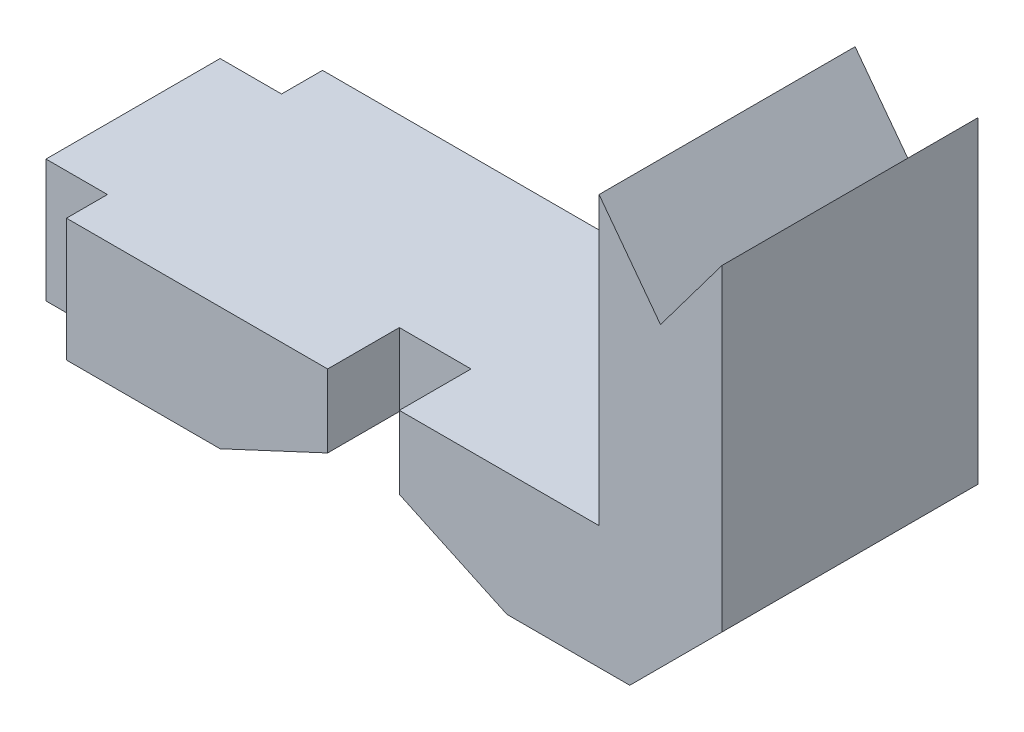
ISO-10303-21;
HEADER;
FILE_DESCRIPTION(('STEP AP214'),'2;1');
FILE_NAME('part.step','',(''),(''),'','','');
FILE_SCHEMA(('AUTOMOTIVE_DESIGN { 1 0 10303 214 1 1 1 1 }'));
ENDSEC;
DATA;
#1=APPLICATION_CONTEXT('core data for automotive mechanical design processes');
#2=APPLICATION_PROTOCOL_DEFINITION('international standard','automotive_design',2000,#1);
#3=PRODUCT_CONTEXT('',#1,'mechanical');
#4=PRODUCT('Part','Part','',(#3));
#5=PRODUCT_RELATED_PRODUCT_CATEGORY('part','',(#4));
#6=PRODUCT_DEFINITION_FORMATION('','',#4);
#7=PRODUCT_DEFINITION_CONTEXT('part definition',#1,'design');
#8=PRODUCT_DEFINITION('design','',#6,#7);
#9=PRODUCT_DEFINITION_SHAPE('','',#8);
#10=(LENGTH_UNIT() NAMED_UNIT(*) SI_UNIT(.MILLI.,.METRE.));
#11=(NAMED_UNIT(*) PLANE_ANGLE_UNIT() SI_UNIT($,.RADIAN.));
#12=(NAMED_UNIT(*) SI_UNIT($,.STERADIAN.) SOLID_ANGLE_UNIT());
#13=UNCERTAINTY_MEASURE_WITH_UNIT(LENGTH_MEASURE(1.E-05),#10,'distance_accuracy_value','');
#14=(GEOMETRIC_REPRESENTATION_CONTEXT(3) GLOBAL_UNCERTAINTY_ASSIGNED_CONTEXT((#13)) GLOBAL_UNIT_ASSIGNED_CONTEXT((#10,
#11,#12)) REPRESENTATION_CONTEXT('',''));
#15=CARTESIAN_POINT('',(0.,0.,0.));
#16=DIRECTION('',(0.,0.,1.));
#17=DIRECTION('',(1.,0.,0.));
#18=AXIS2_PLACEMENT_3D('',#15,#16,#17);
#19=CARTESIAN_POINT('',(0.,0.,25.));
#20=DIRECTION('',(0.,0.,1.));
#21=DIRECTION('',(1.,0.,0.));
#22=AXIS2_PLACEMENT_3D('',#19,#20,#21);
#23=PLANE('',#22);
#24=DIRECTION('',(0.,1.,0.));
#25=VECTOR('',#24,1.);
#26=CARTESIAN_POINT('',(3.5,-20.,25.));
#27=LINE('',#26,#25);
#28=CARTESIAN_POINT('',(3.5,-15.1037695893726,25.));
#29=VERTEX_POINT('',#28);
#30=CARTESIAN_POINT('',(3.5,-8.,25.));
#31=VERTEX_POINT('',#30);
#32=EDGE_CURVE('E180',#29,#31,#27,.T.);
#33=ORIENTED_EDGE('',*,*,#32,.F.);
#34=DIRECTION('',(0.906307787036653,-0.422618261740694,0.));
#35=VECTOR('',#34,1.);
#36=CARTESIAN_POINT('',(-5.15995769899554,-11.0655649950327,25.));
#37=LINE('',#36,#35);
#38=CARTESIAN_POINT('',(14.,-20.,25.));
#39=VERTEX_POINT('',#38);
#40=EDGE_CURVE('E242',#29,#39,#37,.T.);
#41=ORIENTED_EDGE('',*,*,#40,.T.);
#42=DIRECTION('',(1.,0.,0.));
#43=VECTOR('',#42,1.);
#44=CARTESIAN_POINT('',(0.,-20.,25.));
#45=LINE('',#44,#43);
#46=CARTESIAN_POINT('',(26.,-20.,25.));
#47=VERTEX_POINT('',#46);
#48=EDGE_CURVE('E278',#39,#47,#45,.T.);
#49=ORIENTED_EDGE('',*,*,#48,.T.);
#50=DIRECTION('',(0.707106781186551,0.707106781186544,0.));
#51=VECTOR('',#50,1.);
#52=CARTESIAN_POINT('',(22.9999999999999,-23.0000000000001,25.));
#53=LINE('',#52,#51);
#54=CARTESIAN_POINT('',(35.,-11.0000000000001,25.));
#55=VERTEX_POINT('',#54);
#56=EDGE_CURVE('E255',#47,#55,#53,.T.);
#57=ORIENTED_EDGE('',*,*,#56,.T.);
#58=DIRECTION('',(0.,1.,0.));
#59=VECTOR('',#58,1.);
#60=CARTESIAN_POINT('',(35.,0.,25.));
#61=LINE('',#60,#59);
#62=CARTESIAN_POINT('',(35.,20.,25.));
#63=VERTEX_POINT('',#62);
#64=EDGE_CURVE('E282',#55,#63,#61,.T.);
#65=ORIENTED_EDGE('',*,*,#64,.T.);
#66=DIRECTION('',(0.6,0.8,0.));
#67=VECTOR('',#66,1.);
#68=CARTESIAN_POINT('',(12.8,-9.6,25.));
#69=LINE('',#68,#67);
#70=CARTESIAN_POINT('',(29.,12.,25.));
#71=VERTEX_POINT('',#70);
#72=EDGE_CURVE('E234',#71,#63,#69,.T.);
#73=ORIENTED_EDGE('',*,*,#72,.F.);
#74=DIRECTION('',(0.6,-0.8,0.));
#75=VECTOR('',#74,1.);
#76=CARTESIAN_POINT('',(24.32,18.24,25.));
#77=LINE('',#76,#75);
#78=CARTESIAN_POINT('',(23.,20.,25.));
#79=VERTEX_POINT('',#78);
#80=EDGE_CURVE('E226',#79,#71,#77,.T.);
#81=ORIENTED_EDGE('',*,*,#80,.F.);
#82=DIRECTION('',(0.,1.,0.));
#83=VECTOR('',#82,1.);
#84=CARTESIAN_POINT('',(23.,0.,25.));
#85=LINE('',#84,#83);
#86=CARTESIAN_POINT('',(23.,-8.,25.));
#87=VERTEX_POINT('',#86);
#88=EDGE_CURVE('E271',#87,#79,#85,.T.);
#89=ORIENTED_EDGE('',*,*,#88,.F.);
#90=DIRECTION('',(1.,0.,0.));
#91=VECTOR('',#90,1.);
#92=CARTESIAN_POINT('',(0.,-8.,25.));
#93=LINE('',#92,#91);
#94=EDGE_CURVE('E274',#31,#87,#93,.T.);
#95=ORIENTED_EDGE('',*,*,#94,.F.);
#96=EDGE_LOOP('',(#33,#41,#49,#57,#65,#73,#81,#89,#95));
#97=FACE_BOUND('',#96,.T.);
#98=ADVANCED_FACE('F36',(#97),#23,.T.);
#99=CARTESIAN_POINT('',(0.,-20.,25.));
#100=DIRECTION('',(0.,1.,0.));
#101=DIRECTION('',(0.,0.,1.));
#102=AXIS2_PLACEMENT_3D('',#99,#100,#101);
#103=PLANE('',#102);
#104=DIRECTION('',(0.,0.,1.));
#105=VECTOR('',#104,1.);
#106=CARTESIAN_POINT('',(14.,-20.,0.));
#107=LINE('',#106,#105);
#108=CARTESIAN_POINT('',(14.,-20.,0.));
#109=VERTEX_POINT('',#108);
#110=EDGE_CURVE('E252',#109,#39,#107,.T.);
#111=ORIENTED_EDGE('',*,*,#110,.F.);
#112=DIRECTION('',(1.,0.,0.));
#113=VECTOR('',#112,1.);
#114=CARTESIAN_POINT('',(0.,-20.,0.));
#115=LINE('',#114,#113);
#116=CARTESIAN_POINT('',(26.,-20.,0.));
#117=VERTEX_POINT('',#116);
#118=EDGE_CURVE('E290',#109,#117,#115,.T.);
#119=ORIENTED_EDGE('',*,*,#118,.T.);
#120=DIRECTION('',(0.,0.,1.));
#121=VECTOR('',#120,1.);
#122=CARTESIAN_POINT('',(26.,-20.,0.));
#123=LINE('',#122,#121);
#124=EDGE_CURVE('E263',#117,#47,#123,.T.);
#125=ORIENTED_EDGE('',*,*,#124,.T.);
#126=ORIENTED_EDGE('',*,*,#48,.F.);
#127=EDGE_LOOP('',(#111,#119,#125,#126));
#128=FACE_BOUND('',#127,.T.);
#129=ADVANCED_FACE('F336',(#128),#103,.F.);
#130=DIRECTION('',(0.,1.,0.));
#131=VECTOR('',#130,1.);
#132=CARTESIAN_POINT('',(-3.5,-20.,25.));
#133=LINE('',#132,#131);
#134=CARTESIAN_POINT('',(-3.5,-15.1037695893726,25.));
#135=VERTEX_POINT('',#134);
#136=CARTESIAN_POINT('',(-3.5,-8.,25.));
#137=VERTEX_POINT('',#136);
#138=EDGE_CURVE('E190',#135,#137,#133,.T.);
#139=ORIENTED_EDGE('',*,*,#138,.T.);
#140=CARTESIAN_POINT('',(-29.,-8.,25.));
#141=VERTEX_POINT('',#140);
#142=EDGE_CURVE('E276',#141,#137,#93,.T.);
#143=ORIENTED_EDGE('',*,*,#142,.F.);
#144=DIRECTION('',(0.,1.,0.));
#145=VECTOR('',#144,1.);
#146=CARTESIAN_POINT('',(-29.,-20.,25.));
#147=LINE('',#146,#145);
#148=CARTESIAN_POINT('',(-29.,-20.,25.));
#149=VERTEX_POINT('',#148);
#150=EDGE_CURVE('E219',#149,#141,#147,.T.);
#151=ORIENTED_EDGE('',*,*,#150,.F.);
#152=CARTESIAN_POINT('',(-14.,-20.,25.));
#153=VERTEX_POINT('',#152);
#154=EDGE_CURVE('E279',#149,#153,#45,.T.);
#155=ORIENTED_EDGE('',*,*,#154,.T.);
#156=DIRECTION('',(-0.906307787036653,-0.422618261740694,0.));
#157=VECTOR('',#156,1.);
#158=CARTESIAN_POINT('',(5.15995769899554,-11.0655649950327,25.));
#159=LINE('',#158,#157);
#160=EDGE_CURVE('E246',#135,#153,#159,.T.);
#161=ORIENTED_EDGE('',*,*,#160,.F.);
#162=EDGE_LOOP('',(#139,#143,#151,#155,#161));
#163=FACE_BOUND('',#162,.T.);
#164=ADVANCED_FACE('F317',(#163),#23,.T.);
#165=CARTESIAN_POINT('',(0.,0.,0.));
#166=DIRECTION('',(0.,0.,1.));
#167=DIRECTION('',(1.,0.,0.));
#168=AXIS2_PLACEMENT_3D('',#165,#166,#167);
#169=PLANE('',#168);
#170=CARTESIAN_POINT('',(-29.,-20.,0.));
#171=VERTEX_POINT('',#170);
#172=CARTESIAN_POINT('',(-14.,-20.,0.));
#173=VERTEX_POINT('',#172);
#174=EDGE_CURVE('E291',#171,#173,#115,.T.);
#175=ORIENTED_EDGE('',*,*,#174,.F.);
#176=DIRECTION('',(0.,1.,0.));
#177=VECTOR('',#176,1.);
#178=CARTESIAN_POINT('',(-29.,-20.,0.));
#179=LINE('',#178,#177);
#180=CARTESIAN_POINT('',(-29.,-8.,0.));
#181=VERTEX_POINT('',#180);
#182=EDGE_CURVE('E205',#171,#181,#179,.T.);
#183=ORIENTED_EDGE('',*,*,#182,.T.);
#184=DIRECTION('',(1.,0.,0.));
#185=VECTOR('',#184,1.);
#186=CARTESIAN_POINT('',(0.,-8.,0.));
#187=LINE('',#186,#185);
#188=CARTESIAN_POINT('',(23.,-8.,0.));
#189=VERTEX_POINT('',#188);
#190=EDGE_CURVE('E288',#181,#189,#187,.T.);
#191=ORIENTED_EDGE('',*,*,#190,.T.);
#192=DIRECTION('',(0.,1.,0.));
#193=VECTOR('',#192,1.);
#194=CARTESIAN_POINT('',(23.,0.,0.));
#195=LINE('',#194,#193);
#196=CARTESIAN_POINT('',(23.,20.,0.));
#197=VERTEX_POINT('',#196);
#198=EDGE_CURVE('E268',#189,#197,#195,.T.);
#199=ORIENTED_EDGE('',*,*,#198,.T.);
#200=DIRECTION('',(0.6,-0.8,0.));
#201=VECTOR('',#200,1.);
#202=CARTESIAN_POINT('',(24.32,18.24,0.));
#203=LINE('',#202,#201);
#204=CARTESIAN_POINT('',(29.,12.,0.));
#205=VERTEX_POINT('',#204);
#206=EDGE_CURVE('E230',#197,#205,#203,.T.);
#207=ORIENTED_EDGE('',*,*,#206,.T.);
#208=DIRECTION('',(0.6,0.8,0.));
#209=VECTOR('',#208,1.);
#210=CARTESIAN_POINT('',(12.8,-9.6,0.));
#211=LINE('',#210,#209);
#212=CARTESIAN_POINT('',(35.,20.,0.));
#213=VERTEX_POINT('',#212);
#214=EDGE_CURVE('E233',#205,#213,#211,.T.);
#215=ORIENTED_EDGE('',*,*,#214,.T.);
#216=DIRECTION('',(0.,1.,0.));
#217=VECTOR('',#216,1.);
#218=CARTESIAN_POINT('',(35.,0.,0.));
#219=LINE('',#218,#217);
#220=CARTESIAN_POINT('',(35.,-11.0000000000001,0.));
#221=VERTEX_POINT('',#220);
#222=EDGE_CURVE('E275',#221,#213,#219,.T.);
#223=ORIENTED_EDGE('',*,*,#222,.F.);
#224=DIRECTION('',(0.707106781186551,0.707106781186544,0.));
#225=VECTOR('',#224,1.);
#226=CARTESIAN_POINT('',(22.9999999999999,-23.0000000000001,0.));
#227=LINE('',#226,#225);
#228=EDGE_CURVE('E261',#117,#221,#227,.T.);
#229=ORIENTED_EDGE('',*,*,#228,.F.);
#230=ORIENTED_EDGE('',*,*,#118,.F.);
#231=DIRECTION('',(0.906307787036653,-0.422618261740694,0.));
#232=VECTOR('',#231,1.);
#233=CARTESIAN_POINT('',(-5.15995769899554,-11.0655649950327,0.));
#234=LINE('',#233,#232);
#235=CARTESIAN_POINT('',(0.,-13.4716927858301,0.));
#236=VERTEX_POINT('',#235);
#237=EDGE_CURVE('E243',#236,#109,#234,.T.);
#238=ORIENTED_EDGE('',*,*,#237,.F.);
#239=DIRECTION('',(-0.906307787036653,-0.422618261740694,0.));
#240=VECTOR('',#239,1.);
#241=CARTESIAN_POINT('',(5.15995769899554,-11.0655649950327,0.));
#242=LINE('',#241,#240);
#243=EDGE_CURVE('E245',#236,#173,#242,.T.);
#244=ORIENTED_EDGE('',*,*,#243,.T.);
#245=EDGE_LOOP('',(#175,#183,#191,#199,#207,#215,#223,#229,#230,#238,#244));
#246=FACE_BOUND('',#245,.T.);
#247=ADVANCED_FACE('F327',(#246),#169,.F.);
#248=DIRECTION('',(1.,0.,0.));
#249=VECTOR('',#248,1.);
#250=CARTESIAN_POINT('',(-35.,-20.,4.));
#251=LINE('',#250,#249);
#252=CARTESIAN_POINT('',(-35.,-20.,4.));
#253=VERTEX_POINT('',#252);
#254=CARTESIAN_POINT('',(-29.,-20.,4.));
#255=VERTEX_POINT('',#254);
#256=EDGE_CURVE('E59',#253,#255,#251,.T.);
#257=ORIENTED_EDGE('',*,*,#256,.T.);
#258=DIRECTION('',(0.,0.,-1.));
#259=VECTOR('',#258,1.);
#260=CARTESIAN_POINT('',(-29.,-20.,0.));
#261=LINE('',#260,#259);
#262=EDGE_CURVE('E197',#255,#171,#261,.T.);
#263=ORIENTED_EDGE('',*,*,#262,.T.);
#264=ORIENTED_EDGE('',*,*,#174,.T.);
#265=DIRECTION('',(0.,0.,1.));
#266=VECTOR('',#265,1.);
#267=CARTESIAN_POINT('',(-14.,-20.,0.));
#268=LINE('',#267,#266);
#269=EDGE_CURVE('E256',#173,#153,#268,.T.);
#270=ORIENTED_EDGE('',*,*,#269,.T.);
#271=ORIENTED_EDGE('',*,*,#154,.F.);
#272=DIRECTION('',(0.,0.,-1.));
#273=VECTOR('',#272,1.);
#274=CARTESIAN_POINT('',(-29.,-20.,25.));
#275=LINE('',#274,#273);
#276=CARTESIAN_POINT('',(-29.,-20.,21.));
#277=VERTEX_POINT('',#276);
#278=EDGE_CURVE('E212',#149,#277,#275,.T.);
#279=ORIENTED_EDGE('',*,*,#278,.T.);
#280=DIRECTION('',(-1.,0.,0.));
#281=VECTOR('',#280,1.);
#282=CARTESIAN_POINT('',(-35.,-20.,21.));
#283=LINE('',#282,#281);
#284=CARTESIAN_POINT('',(-35.,-20.,21.));
#285=VERTEX_POINT('',#284);
#286=EDGE_CURVE('E215',#277,#285,#283,.T.);
#287=ORIENTED_EDGE('',*,*,#286,.T.);
#288=DIRECTION('',(0.,0.,-1.));
#289=VECTOR('',#288,1.);
#290=CARTESIAN_POINT('',(-35.,-20.,25.));
#291=LINE('',#290,#289);
#292=EDGE_CURVE('E299',#285,#253,#291,.T.);
#293=ORIENTED_EDGE('',*,*,#292,.T.);
#294=EDGE_LOOP('',(#257,#263,#264,#270,#271,#279,#287,#293));
#295=FACE_BOUND('',#294,.T.);
#296=ADVANCED_FACE('F322',(#295),#103,.F.);
#297=CARTESIAN_POINT('',(35.,0.,25.));
#298=DIRECTION('',(-1.,0.,0.));
#299=DIRECTION('',(0.,0.,1.));
#300=AXIS2_PLACEMENT_3D('',#297,#298,#299);
#301=PLANE('',#300);
#302=DIRECTION('',(0.,0.,1.));
#303=VECTOR('',#302,1.);
#304=CARTESIAN_POINT('',(35.,-11.0000000000001,0.));
#305=LINE('',#304,#303);
#306=EDGE_CURVE('E266',#221,#55,#305,.T.);
#307=ORIENTED_EDGE('',*,*,#306,.F.);
#308=ORIENTED_EDGE('',*,*,#222,.T.);
#309=DIRECTION('',(0.,0.,-1.));
#310=VECTOR('',#309,1.);
#311=CARTESIAN_POINT('',(35.,20.,25.));
#312=LINE('',#311,#310);
#313=EDGE_CURVE('E297',#63,#213,#312,.T.);
#314=ORIENTED_EDGE('',*,*,#313,.F.);
#315=ORIENTED_EDGE('',*,*,#64,.F.);
#316=EDGE_LOOP('',(#307,#308,#314,#315));
#317=FACE_BOUND('',#316,.T.);
#318=ADVANCED_FACE('F346',(#317),#301,.F.);
#319=CARTESIAN_POINT('',(23.,0.,25.));
#320=DIRECTION('',(-1.,0.,0.));
#321=DIRECTION('',(0.,0.,1.));
#322=AXIS2_PLACEMENT_3D('',#319,#320,#321);
#323=PLANE('',#322);
#324=ORIENTED_EDGE('',*,*,#198,.F.);
#325=DIRECTION('',(0.,0.,-1.));
#326=VECTOR('',#325,1.);
#327=CARTESIAN_POINT('',(23.,-8.,25.));
#328=LINE('',#327,#326);
#329=EDGE_CURVE('E305',#87,#189,#328,.T.);
#330=ORIENTED_EDGE('',*,*,#329,.F.);
#331=ORIENTED_EDGE('',*,*,#88,.T.);
#332=DIRECTION('',(0.,0.,-1.));
#333=VECTOR('',#332,1.);
#334=CARTESIAN_POINT('',(23.,20.,25.));
#335=LINE('',#334,#333);
#336=EDGE_CURVE('E285',#79,#197,#335,.T.);
#337=ORIENTED_EDGE('',*,*,#336,.T.);
#338=EDGE_LOOP('',(#324,#330,#331,#337));
#339=FACE_BOUND('',#338,.T.);
#340=ADVANCED_FACE('F38',(#339),#323,.T.);
#341=CARTESIAN_POINT('',(0.,-8.,25.));
#342=DIRECTION('',(0.,1.,0.));
#343=DIRECTION('',(0.,0.,1.));
#344=AXIS2_PLACEMENT_3D('',#341,#342,#343);
#345=PLANE('',#344);
#346=DIRECTION('',(0.,0.,-1.));
#347=VECTOR('',#346,1.);
#348=CARTESIAN_POINT('',(3.5,-8.,25.));
#349=LINE('',#348,#347);
#350=CARTESIAN_POINT('',(3.5,-8.,18.));
#351=VERTEX_POINT('',#350);
#352=EDGE_CURVE('E177',#31,#351,#349,.T.);
#353=ORIENTED_EDGE('',*,*,#352,.F.);
#354=ORIENTED_EDGE('',*,*,#94,.T.);
#355=ORIENTED_EDGE('',*,*,#329,.T.);
#356=ORIENTED_EDGE('',*,*,#190,.F.);
#357=DIRECTION('',(0.,0.,-1.));
#358=VECTOR('',#357,1.);
#359=CARTESIAN_POINT('',(-29.,-8.,0.));
#360=LINE('',#359,#358);
#361=CARTESIAN_POINT('',(-29.,-8.,4.));
#362=VERTEX_POINT('',#361);
#363=EDGE_CURVE('E198',#362,#181,#360,.T.);
#364=ORIENTED_EDGE('',*,*,#363,.F.);
#365=DIRECTION('',(1.,0.,0.));
#366=VECTOR('',#365,1.);
#367=CARTESIAN_POINT('',(-35.,-8.,4.));
#368=LINE('',#367,#366);
#369=CARTESIAN_POINT('',(-35.,-8.,4.));
#370=VERTEX_POINT('',#369);
#371=EDGE_CURVE('E195',#370,#362,#368,.T.);
#372=ORIENTED_EDGE('',*,*,#371,.F.);
#373=DIRECTION('',(0.,0.,-1.));
#374=VECTOR('',#373,1.);
#375=CARTESIAN_POINT('',(-35.,-8.,25.));
#376=LINE('',#375,#374);
#377=CARTESIAN_POINT('',(-35.,-8.,21.));
#378=VERTEX_POINT('',#377);
#379=EDGE_CURVE('E302',#378,#370,#376,.T.);
#380=ORIENTED_EDGE('',*,*,#379,.F.);
#381=DIRECTION('',(-1.,0.,0.));
#382=VECTOR('',#381,1.);
#383=CARTESIAN_POINT('',(-35.,-8.,21.));
#384=LINE('',#383,#382);
#385=CARTESIAN_POINT('',(-29.,-8.,21.));
#386=VERTEX_POINT('',#385);
#387=EDGE_CURVE('E216',#386,#378,#384,.T.);
#388=ORIENTED_EDGE('',*,*,#387,.F.);
#389=DIRECTION('',(0.,0.,-1.));
#390=VECTOR('',#389,1.);
#391=CARTESIAN_POINT('',(-29.,-8.,25.));
#392=LINE('',#391,#390);
#393=EDGE_CURVE('E208',#141,#386,#392,.T.);
#394=ORIENTED_EDGE('',*,*,#393,.F.);
#395=ORIENTED_EDGE('',*,*,#142,.T.);
#396=DIRECTION('',(0.,0.,1.));
#397=VECTOR('',#396,1.);
#398=CARTESIAN_POINT('',(-3.5,-8.,25.));
#399=LINE('',#398,#397);
#400=CARTESIAN_POINT('',(-3.5,-8.,18.));
#401=VERTEX_POINT('',#400);
#402=EDGE_CURVE('E174',#401,#137,#399,.T.);
#403=ORIENTED_EDGE('',*,*,#402,.F.);
#404=DIRECTION('',(-1.,0.,0.));
#405=VECTOR('',#404,1.);
#406=CARTESIAN_POINT('',(-3.5,-8.,18.));
#407=LINE('',#406,#405);
#408=EDGE_CURVE('E168',#351,#401,#407,.T.);
#409=ORIENTED_EDGE('',*,*,#408,.F.);
#410=EDGE_LOOP('',(#353,#354,#355,#356,#364,#372,#380,#388,#394,#395,#403,#409));
#411=FACE_BOUND('',#410,.T.);
#412=ADVANCED_FACE('F184',(#411),#345,.T.);
#413=CARTESIAN_POINT('',(-35.,0.,25.));
#414=DIRECTION('',(-1.,0.,0.));
#415=DIRECTION('',(0.,0.,1.));
#416=AXIS2_PLACEMENT_3D('',#413,#414,#415);
#417=PLANE('',#416);
#418=DIRECTION('',(0.,1.,0.));
#419=VECTOR('',#418,1.);
#420=CARTESIAN_POINT('',(-35.,-20.,4.));
#421=LINE('',#420,#419);
#422=EDGE_CURVE('E201',#253,#370,#421,.T.);
#423=ORIENTED_EDGE('',*,*,#422,.F.);
#424=ORIENTED_EDGE('',*,*,#292,.F.);
#425=DIRECTION('',(0.,1.,0.));
#426=VECTOR('',#425,1.);
#427=CARTESIAN_POINT('',(-35.,-20.,21.));
#428=LINE('',#427,#426);
#429=EDGE_CURVE('E223',#285,#378,#428,.T.);
#430=ORIENTED_EDGE('',*,*,#429,.T.);
#431=ORIENTED_EDGE('',*,*,#379,.T.);
#432=EDGE_LOOP('',(#423,#424,#430,#431));
#433=FACE_BOUND('',#432,.T.);
#434=ADVANCED_FACE('F367',(#433),#417,.T.);
#435=CARTESIAN_POINT('',(22.9999999999999,-23.0000000000001,0.));
#436=DIRECTION('',(0.707106781186544,-0.707106781186551,0.));
#437=DIRECTION('',(0.707106781186551,0.707106781186544,0.));
#438=AXIS2_PLACEMENT_3D('',#435,#436,#437);
#439=PLANE('',#438);
#440=ORIENTED_EDGE('',*,*,#56,.F.);
#441=ORIENTED_EDGE('',*,*,#124,.F.);
#442=ORIENTED_EDGE('',*,*,#228,.T.);
#443=ORIENTED_EDGE('',*,*,#306,.T.);
#444=EDGE_LOOP('',(#440,#441,#442,#443));
#445=FACE_BOUND('',#444,.T.);
#446=ADVANCED_FACE('F342',(#445),#439,.T.);
#447=CARTESIAN_POINT('',(-5.15995769899554,-11.0655649950327,0.));
#448=DIRECTION('',(-0.422618261740694,-0.906307787036653,0.));
#449=DIRECTION('',(0.906307787036653,-0.422618261740694,0.));
#450=AXIS2_PLACEMENT_3D('',#447,#448,#449);
#451=PLANE('',#450);
#452=DIRECTION('',(0.,0.,1.));
#453=VECTOR('',#452,1.);
#454=CARTESIAN_POINT('',(3.5,-15.1037695893726,0.));
#455=LINE('',#454,#453);
#456=CARTESIAN_POINT('',(3.5,-15.1037695893726,18.));
#457=VERTEX_POINT('',#456);
#458=EDGE_CURVE('E11',#457,#29,#455,.T.);
#459=ORIENTED_EDGE('',*,*,#458,.F.);
#460=DIRECTION('',(0.906307787036653,-0.422618261740694,0.));
#461=VECTOR('',#460,1.);
#462=CARTESIAN_POINT('',(-5.15995769899554,-11.0655649950327,18.));
#463=LINE('',#462,#461);
#464=CARTESIAN_POINT('',(0.,-13.4716927858301,18.));
#465=VERTEX_POINT('',#464);
#466=EDGE_CURVE('E171',#465,#457,#463,.T.);
#467=ORIENTED_EDGE('',*,*,#466,.F.);
#468=DIRECTION('',(0.,0.,1.));
#469=VECTOR('',#468,1.);
#470=CARTESIAN_POINT('',(0.,-13.4716927858301,0.));
#471=LINE('',#470,#469);
#472=EDGE_CURVE('E249',#236,#465,#471,.T.);
#473=ORIENTED_EDGE('',*,*,#472,.F.);
#474=ORIENTED_EDGE('',*,*,#237,.T.);
#475=ORIENTED_EDGE('',*,*,#110,.T.);
#476=ORIENTED_EDGE('',*,*,#40,.F.);
#477=EDGE_LOOP('',(#459,#467,#473,#474,#475,#476));
#478=FACE_BOUND('',#477,.T.);
#479=ADVANCED_FACE('F332',(#478),#451,.T.);
#480=CARTESIAN_POINT('',(5.15995769899554,-11.0655649950327,0.));
#481=DIRECTION('',(-0.422618261740694,0.906307787036653,0.));
#482=DIRECTION('',(-0.906307787036653,-0.422618261740694,0.));
#483=AXIS2_PLACEMENT_3D('',#480,#481,#482);
#484=PLANE('',#483);
#485=DIRECTION('',(-0.906307787036653,-0.422618261740694,0.));
#486=VECTOR('',#485,1.);
#487=CARTESIAN_POINT('',(5.15995769899554,-11.0655649950327,18.));
#488=LINE('',#487,#486);
#489=CARTESIAN_POINT('',(-3.5,-15.1037695893726,18.));
#490=VERTEX_POINT('',#489);
#491=EDGE_CURVE('E308',#465,#490,#488,.T.);
#492=ORIENTED_EDGE('',*,*,#491,.T.);
#493=DIRECTION('',(0.,0.,1.));
#494=VECTOR('',#493,1.);
#495=CARTESIAN_POINT('',(-3.5,-15.1037695893726,0.));
#496=LINE('',#495,#494);
#497=EDGE_CURVE('E44',#490,#135,#496,.T.);
#498=ORIENTED_EDGE('',*,*,#497,.T.);
#499=ORIENTED_EDGE('',*,*,#160,.T.);
#500=ORIENTED_EDGE('',*,*,#269,.F.);
#501=ORIENTED_EDGE('',*,*,#243,.F.);
#502=ORIENTED_EDGE('',*,*,#472,.T.);
#503=EDGE_LOOP('',(#492,#498,#499,#500,#501,#502));
#504=FACE_BOUND('',#503,.T.);
#505=ADVANCED_FACE('F313',(#504),#484,.F.);
#506=CARTESIAN_POINT('',(24.32,18.24,0.));
#507=DIRECTION('',(-0.8,-0.6,0.));
#508=DIRECTION('',(0.6,-0.8,0.));
#509=AXIS2_PLACEMENT_3D('',#506,#507,#508);
#510=PLANE('',#509);
#511=ORIENTED_EDGE('',*,*,#80,.T.);
#512=DIRECTION('',(0.,0.,1.));
#513=VECTOR('',#512,1.);
#514=CARTESIAN_POINT('',(29.,12.,0.));
#515=LINE('',#514,#513);
#516=EDGE_CURVE('E237',#205,#71,#515,.T.);
#517=ORIENTED_EDGE('',*,*,#516,.F.);
#518=ORIENTED_EDGE('',*,*,#206,.F.);
#519=ORIENTED_EDGE('',*,*,#336,.F.);
#520=EDGE_LOOP('',(#511,#517,#518,#519));
#521=FACE_BOUND('',#520,.T.);
#522=ADVANCED_FACE('F451',(#521),#510,.F.);
#523=CARTESIAN_POINT('',(12.8,-9.6,0.));
#524=DIRECTION('',(0.8,-0.6,0.));
#525=DIRECTION('',(0.6,0.8,0.));
#526=AXIS2_PLACEMENT_3D('',#523,#524,#525);
#527=PLANE('',#526);
#528=ORIENTED_EDGE('',*,*,#72,.T.);
#529=ORIENTED_EDGE('',*,*,#313,.T.);
#530=ORIENTED_EDGE('',*,*,#214,.F.);
#531=ORIENTED_EDGE('',*,*,#516,.T.);
#532=EDGE_LOOP('',(#528,#529,#530,#531));
#533=FACE_BOUND('',#532,.T.);
#534=ADVANCED_FACE('F350',(#533),#527,.F.);
#535=CARTESIAN_POINT('',(-35.,-20.,21.));
#536=DIRECTION('',(0.,0.,-1.));
#537=DIRECTION('',(-1.,0.,0.));
#538=AXIS2_PLACEMENT_3D('',#535,#536,#537);
#539=PLANE('',#538);
#540=ORIENTED_EDGE('',*,*,#387,.T.);
#541=ORIENTED_EDGE('',*,*,#429,.F.);
#542=ORIENTED_EDGE('',*,*,#286,.F.);
#543=DIRECTION('',(0.,1.,0.));
#544=VECTOR('',#543,1.);
#545=CARTESIAN_POINT('',(-29.,-20.,21.));
#546=LINE('',#545,#544);
#547=EDGE_CURVE('E227',#277,#386,#546,.T.);
#548=ORIENTED_EDGE('',*,*,#547,.T.);
#549=EDGE_LOOP('',(#540,#541,#542,#548));
#550=FACE_BOUND('',#549,.T.);
#551=ADVANCED_FACE('F373',(#550),#539,.F.);
#552=CARTESIAN_POINT('',(-29.,-20.,25.));
#553=DIRECTION('',(1.,0.,0.));
#554=DIRECTION('',(0.,0.,-1.));
#555=AXIS2_PLACEMENT_3D('',#552,#553,#554);
#556=PLANE('',#555);
#557=ORIENTED_EDGE('',*,*,#393,.T.);
#558=ORIENTED_EDGE('',*,*,#547,.F.);
#559=ORIENTED_EDGE('',*,*,#278,.F.);
#560=ORIENTED_EDGE('',*,*,#150,.T.);
#561=EDGE_LOOP('',(#557,#558,#559,#560));
#562=FACE_BOUND('',#561,.T.);
#563=ADVANCED_FACE('F375',(#562),#556,.F.);
#564=CARTESIAN_POINT('',(-29.,-20.,0.));
#565=DIRECTION('',(1.,0.,0.));
#566=DIRECTION('',(0.,0.,-1.));
#567=AXIS2_PLACEMENT_3D('',#564,#565,#566);
#568=PLANE('',#567);
#569=ORIENTED_EDGE('',*,*,#363,.T.);
#570=ORIENTED_EDGE('',*,*,#182,.F.);
#571=ORIENTED_EDGE('',*,*,#262,.F.);
#572=DIRECTION('',(0.,1.,0.));
#573=VECTOR('',#572,1.);
#574=CARTESIAN_POINT('',(-29.,-20.,4.));
#575=LINE('',#574,#573);
#576=EDGE_CURVE('E209',#255,#362,#575,.T.);
#577=ORIENTED_EDGE('',*,*,#576,.T.);
#578=EDGE_LOOP('',(#569,#570,#571,#577));
#579=FACE_BOUND('',#578,.T.);
#580=ADVANCED_FACE('F363',(#579),#568,.F.);
#581=CARTESIAN_POINT('',(-35.,-20.,4.));
#582=DIRECTION('',(0.,0.,1.));
#583=DIRECTION('',(1.,0.,0.));
#584=AXIS2_PLACEMENT_3D('',#581,#582,#583);
#585=PLANE('',#584);
#586=ORIENTED_EDGE('',*,*,#371,.T.);
#587=ORIENTED_EDGE('',*,*,#576,.F.);
#588=ORIENTED_EDGE('',*,*,#256,.F.);
#589=ORIENTED_EDGE('',*,*,#422,.T.);
#590=EDGE_LOOP('',(#586,#587,#588,#589));
#591=FACE_BOUND('',#590,.T.);
#592=ADVANCED_FACE('F369',(#591),#585,.F.);
#593=CARTESIAN_POINT('',(-3.5,-20.,25.));
#594=DIRECTION('',(-1.,0.,0.));
#595=DIRECTION('',(0.,0.,1.));
#596=AXIS2_PLACEMENT_3D('',#593,#594,#595);
#597=PLANE('',#596);
#598=DIRECTION('',(0.,1.,0.));
#599=VECTOR('',#598,1.);
#600=CARTESIAN_POINT('',(-3.5,-20.,18.));
#601=LINE('',#600,#599);
#602=EDGE_CURVE('E51',#490,#401,#601,.T.);
#603=ORIENTED_EDGE('',*,*,#602,.T.);
#604=ORIENTED_EDGE('',*,*,#402,.T.);
#605=ORIENTED_EDGE('',*,*,#138,.F.);
#606=ORIENTED_EDGE('',*,*,#497,.F.);
#607=EDGE_LOOP('',(#603,#604,#605,#606));
#608=FACE_BOUND('',#607,.T.);
#609=ADVANCED_FACE('F480',(#608),#597,.F.);
#610=CARTESIAN_POINT('',(3.5,-20.,25.));
#611=DIRECTION('',(1.,0.,0.));
#612=DIRECTION('',(0.,0.,-1.));
#613=AXIS2_PLACEMENT_3D('',#610,#611,#612);
#614=PLANE('',#613);
#615=ORIENTED_EDGE('',*,*,#458,.T.);
#616=ORIENTED_EDGE('',*,*,#32,.T.);
#617=ORIENTED_EDGE('',*,*,#352,.T.);
#618=DIRECTION('',(0.,1.,0.));
#619=VECTOR('',#618,1.);
#620=CARTESIAN_POINT('',(3.5,-20.,18.));
#621=LINE('',#620,#619);
#622=EDGE_CURVE('E164',#457,#351,#621,.T.);
#623=ORIENTED_EDGE('',*,*,#622,.F.);
#624=EDGE_LOOP('',(#615,#616,#617,#623));
#625=FACE_BOUND('',#624,.T.);
#626=ADVANCED_FACE('F178',(#625),#614,.F.);
#627=CARTESIAN_POINT('',(-3.5,-20.,18.));
#628=DIRECTION('',(0.,0.,-1.));
#629=DIRECTION('',(-1.,0.,0.));
#630=AXIS2_PLACEMENT_3D('',#627,#628,#629);
#631=PLANE('',#630);
#632=ORIENTED_EDGE('',*,*,#466,.T.);
#633=ORIENTED_EDGE('',*,*,#622,.T.);
#634=ORIENTED_EDGE('',*,*,#408,.T.);
#635=ORIENTED_EDGE('',*,*,#602,.F.);
#636=ORIENTED_EDGE('',*,*,#491,.F.);
#637=EDGE_LOOP('',(#632,#633,#634,#635,#636));
#638=FACE_BOUND('',#637,.T.);
#639=ADVANCED_FACE('F166',(#638),#631,.F.);
#640=CLOSED_SHELL('',(#98,#129,#164,#247,#296,#318,#340,#412,#434,#446,#479,#505,#522,#534,#551,
#563,#580,#592,#609,#626,#639));
#641=MANIFOLD_SOLID_BREP('B2',#640);
#642=ADVANCED_BREP_SHAPE_REPRESENTATION('',(#18,#641),#14);
#643=SHAPE_DEFINITION_REPRESENTATION(#9,#642);
ENDSEC;
END-ISO-10303-21;
